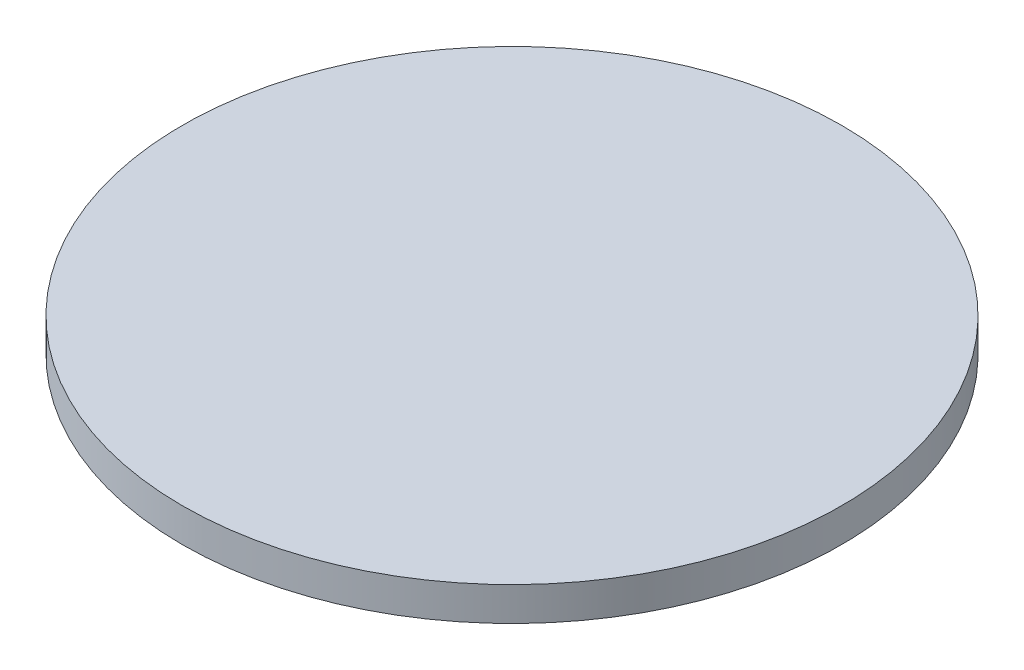
ISO-10303-21;
HEADER;
FILE_DESCRIPTION(('STEP AP214'),'2;1');
FILE_NAME('part.step','',(''),(''),'','','');
FILE_SCHEMA(('AUTOMOTIVE_DESIGN { 1 0 10303 214 1 1 1 1 }'));
ENDSEC;
DATA;
#1=APPLICATION_CONTEXT('core data for automotive mechanical design processes');
#2=APPLICATION_PROTOCOL_DEFINITION('international standard','automotive_design',2000,#1);
#3=PRODUCT_CONTEXT('',#1,'mechanical');
#4=PRODUCT('Part','Part','',(#3));
#5=PRODUCT_RELATED_PRODUCT_CATEGORY('part','',(#4));
#6=PRODUCT_DEFINITION_FORMATION('','',#4);
#7=PRODUCT_DEFINITION_CONTEXT('part definition',#1,'design');
#8=PRODUCT_DEFINITION('design','',#6,#7);
#9=PRODUCT_DEFINITION_SHAPE('','',#8);
#10=(LENGTH_UNIT() NAMED_UNIT(*) SI_UNIT(.MILLI.,.METRE.));
#11=(NAMED_UNIT(*) PLANE_ANGLE_UNIT() SI_UNIT($,.RADIAN.));
#12=(NAMED_UNIT(*) SI_UNIT($,.STERADIAN.) SOLID_ANGLE_UNIT());
#13=UNCERTAINTY_MEASURE_WITH_UNIT(LENGTH_MEASURE(1.E-05),#10,'distance_accuracy_value','');
#14=(GEOMETRIC_REPRESENTATION_CONTEXT(3) GLOBAL_UNCERTAINTY_ASSIGNED_CONTEXT((#13)) GLOBAL_UNIT_ASSIGNED_CONTEXT((#10,
#11,#12)) REPRESENTATION_CONTEXT('',''));
#15=CARTESIAN_POINT('',(0.,0.,0.));
#16=DIRECTION('',(0.,0.,1.));
#17=DIRECTION('',(1.,0.,0.));
#18=AXIS2_PLACEMENT_3D('',#15,#16,#17);
#19=CARTESIAN_POINT('',(0.,2.2,0.));
#20=DIRECTION('',(0.,-1.,0.));
#21=DIRECTION('',(0.,0.,-1.));
#22=AXIS2_PLACEMENT_3D('',#19,#20,#21);
#23=CYLINDRICAL_SURFACE('',#22,21.5);
#24=CARTESIAN_POINT('',(0.,2.2,0.));
#25=DIRECTION('',(0.,1.,0.));
#26=DIRECTION('',(0.,0.,1.));
#27=AXIS2_PLACEMENT_3D('',#24,#25,#26);
#28=CIRCLE('',#27,21.5);
#29=CARTESIAN_POINT('',(0.,2.2,21.5));
#30=VERTEX_POINT('',#29);
#31=EDGE_CURVE('E10',#30,#30,#28,.T.);
#32=ORIENTED_EDGE('',*,*,#31,.F.);
#33=EDGE_LOOP('',(#32));
#34=FACE_BOUND('',#33,.T.);
#35=CARTESIAN_POINT('',(0.,0.,0.));
#36=DIRECTION('',(0.,1.,0.));
#37=DIRECTION('',(0.,0.,1.));
#38=AXIS2_PLACEMENT_3D('',#35,#36,#37);
#39=CIRCLE('',#38,21.5);
#40=CARTESIAN_POINT('',(0.,0.,21.5));
#41=VERTEX_POINT('',#40);
#42=EDGE_CURVE('E33',#41,#41,#39,.T.);
#43=ORIENTED_EDGE('',*,*,#42,.T.);
#44=EDGE_LOOP('',(#43));
#45=FACE_BOUND('',#44,.T.);
#46=ADVANCED_FACE('F30',(#34,#45),#23,.T.);
#47=CARTESIAN_POINT('',(0.,2.2,0.));
#48=DIRECTION('',(0.,1.,0.));
#49=DIRECTION('',(0.,0.,1.));
#50=AXIS2_PLACEMENT_3D('',#47,#48,#49);
#51=PLANE('',#50);
#52=ORIENTED_EDGE('',*,*,#31,.T.);
#53=EDGE_LOOP('',(#52));
#54=FACE_BOUND('',#53,.T.);
#55=ADVANCED_FACE('F45',(#54),#51,.T.);
#56=CARTESIAN_POINT('',(0.,0.,0.));
#57=DIRECTION('',(0.,1.,0.));
#58=DIRECTION('',(0.,0.,1.));
#59=AXIS2_PLACEMENT_3D('',#56,#57,#58);
#60=PLANE('',#59);
#61=ORIENTED_EDGE('',*,*,#42,.F.);
#62=EDGE_LOOP('',(#61));
#63=FACE_BOUND('',#62,.T.);
#64=ADVANCED_FACE('F43',(#63),#60,.F.);
#65=CLOSED_SHELL('',(#46,#55,#64));
#66=MANIFOLD_SOLID_BREP('B2',#65);
#67=ADVANCED_BREP_SHAPE_REPRESENTATION('',(#18,#66),#14);
#68=SHAPE_DEFINITION_REPRESENTATION(#9,#67);
ENDSEC;
END-ISO-10303-21;
